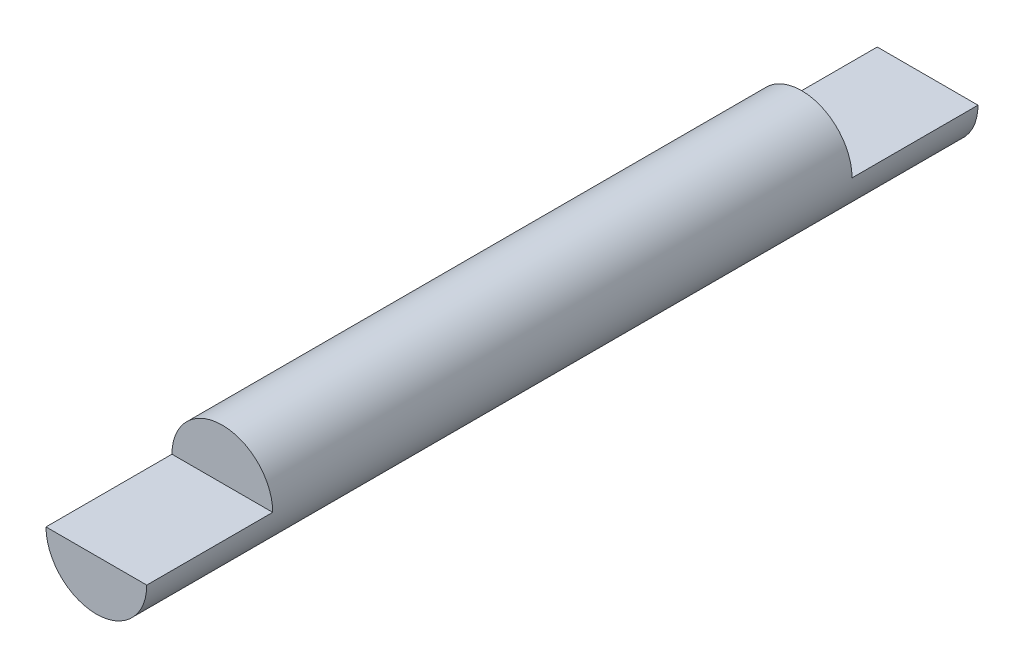
ISO-10303-21;
HEADER;
FILE_DESCRIPTION(('STEP AP214'),'2;1');
FILE_NAME('part.step','',(''),(''),'','','');
FILE_SCHEMA(('AUTOMOTIVE_DESIGN { 1 0 10303 214 1 1 1 1 }'));
ENDSEC;
DATA;
#1=APPLICATION_CONTEXT('core data for automotive mechanical design processes');
#2=APPLICATION_PROTOCOL_DEFINITION('international standard','automotive_design',2000,#1);
#3=PRODUCT_CONTEXT('',#1,'mechanical');
#4=PRODUCT('Part','Part','',(#3));
#5=PRODUCT_RELATED_PRODUCT_CATEGORY('part','',(#4));
#6=PRODUCT_DEFINITION_FORMATION('','',#4);
#7=PRODUCT_DEFINITION_CONTEXT('part definition',#1,'design');
#8=PRODUCT_DEFINITION('design','',#6,#7);
#9=PRODUCT_DEFINITION_SHAPE('','',#8);
#10=(LENGTH_UNIT() NAMED_UNIT(*) SI_UNIT(.MILLI.,.METRE.));
#11=(NAMED_UNIT(*) PLANE_ANGLE_UNIT() SI_UNIT($,.RADIAN.));
#12=(NAMED_UNIT(*) SI_UNIT($,.STERADIAN.) SOLID_ANGLE_UNIT());
#13=UNCERTAINTY_MEASURE_WITH_UNIT(LENGTH_MEASURE(1.E-05),#10,'distance_accuracy_value','');
#14=(GEOMETRIC_REPRESENTATION_CONTEXT(3) GLOBAL_UNCERTAINTY_ASSIGNED_CONTEXT((#13)) GLOBAL_UNIT_ASSIGNED_CONTEXT((#10,
#11,#12)) REPRESENTATION_CONTEXT('',''));
#15=CARTESIAN_POINT('',(0.,0.,0.));
#16=DIRECTION('',(0.,0.,1.));
#17=DIRECTION('',(1.,0.,0.));
#18=AXIS2_PLACEMENT_3D('',#15,#16,#17);
#19=CARTESIAN_POINT('',(0.,0.,33.));
#20=DIRECTION('',(0.,0.,-1.));
#21=DIRECTION('',(-1.,0.,0.));
#22=AXIS2_PLACEMENT_3D('',#19,#20,#21);
#23=CYLINDRICAL_SURFACE('',#22,2.);
#24=CARTESIAN_POINT('',(0.,0.,5.));
#25=DIRECTION('',(0.,0.,1.));
#26=DIRECTION('',(1.,0.,0.));
#27=AXIS2_PLACEMENT_3D('',#24,#25,#26);
#28=CIRCLE('',#27,2.);
#29=CARTESIAN_POINT('',(2.,0.,5.));
#30=VERTEX_POINT('',#29);
#31=CARTESIAN_POINT('',(-2.,0.,5.));
#32=VERTEX_POINT('',#31);
#33=EDGE_CURVE('E39',#30,#32,#28,.T.);
#34=ORIENTED_EDGE('',*,*,#33,.T.);
#35=DIRECTION('',(0.,0.,-1.));
#36=VECTOR('',#35,1.);
#37=CARTESIAN_POINT('',(-2.,0.,5.));
#38=LINE('',#37,#36);
#39=CARTESIAN_POINT('',(-2.,0.,0.));
#40=VERTEX_POINT('',#39);
#41=EDGE_CURVE('E93',#32,#40,#38,.T.);
#42=ORIENTED_EDGE('',*,*,#41,.T.);
#43=CARTESIAN_POINT('',(0.,0.,0.));
#44=DIRECTION('',(0.,0.,1.));
#45=DIRECTION('',(1.,0.,0.));
#46=AXIS2_PLACEMENT_3D('',#43,#44,#45);
#47=CIRCLE('',#46,2.);
#48=CARTESIAN_POINT('',(2.,0.,0.));
#49=VERTEX_POINT('',#48);
#50=EDGE_CURVE('E96',#40,#49,#47,.T.);
#51=ORIENTED_EDGE('',*,*,#50,.T.);
#52=DIRECTION('',(0.,0.,-1.));
#53=VECTOR('',#52,1.);
#54=CARTESIAN_POINT('',(2.,0.,5.));
#55=LINE('',#54,#53);
#56=EDGE_CURVE('E54',#30,#49,#55,.T.);
#57=ORIENTED_EDGE('',*,*,#56,.F.);
#58=EDGE_LOOP('',(#34,#42,#51,#57));
#59=FACE_BOUND('',#58,.T.);
#60=DIRECTION('',(0.,0.,1.));
#61=VECTOR('',#60,1.);
#62=CARTESIAN_POINT('',(2.,0.,28.));
#63=LINE('',#62,#61);
#64=CARTESIAN_POINT('',(2.,0.,28.));
#65=VERTEX_POINT('',#64);
#66=CARTESIAN_POINT('',(2.,0.,33.));
#67=VERTEX_POINT('',#66);
#68=EDGE_CURVE('E78',#65,#67,#63,.T.);
#69=ORIENTED_EDGE('',*,*,#68,.T.);
#70=CARTESIAN_POINT('',(0.,0.,33.));
#71=DIRECTION('',(0.,0.,1.));
#72=DIRECTION('',(1.,0.,0.));
#73=AXIS2_PLACEMENT_3D('',#70,#71,#72);
#74=CIRCLE('',#73,2.);
#75=CARTESIAN_POINT('',(-2.,0.,33.));
#76=VERTEX_POINT('',#75);
#77=EDGE_CURVE('E83',#76,#67,#74,.T.);
#78=ORIENTED_EDGE('',*,*,#77,.F.);
#79=DIRECTION('',(0.,0.,1.));
#80=VECTOR('',#79,1.);
#81=CARTESIAN_POINT('',(-2.,0.,28.));
#82=LINE('',#81,#80);
#83=CARTESIAN_POINT('',(-2.,0.,28.));
#84=VERTEX_POINT('',#83);
#85=EDGE_CURVE('E46',#84,#76,#82,.T.);
#86=ORIENTED_EDGE('',*,*,#85,.F.);
#87=CARTESIAN_POINT('',(0.,0.,28.));
#88=DIRECTION('',(0.,0.,-1.));
#89=DIRECTION('',(-1.,0.,0.));
#90=AXIS2_PLACEMENT_3D('',#87,#88,#89);
#91=CIRCLE('',#90,2.);
#92=EDGE_CURVE('E11',#84,#65,#91,.T.);
#93=ORIENTED_EDGE('',*,*,#92,.T.);
#94=EDGE_LOOP('',(#69,#78,#86,#93));
#95=FACE_BOUND('',#94,.T.);
#96=ADVANCED_FACE('F32',(#59,#95),#23,.T.);
#97=CARTESIAN_POINT('',(0.,0.,33.));
#98=DIRECTION('',(0.,0.,1.));
#99=DIRECTION('',(1.,0.,0.));
#100=AXIS2_PLACEMENT_3D('',#97,#98,#99);
#101=PLANE('',#100);
#102=ORIENTED_EDGE('',*,*,#77,.T.);
#103=DIRECTION('',(-1.,0.,0.));
#104=VECTOR('',#103,1.);
#105=CARTESIAN_POINT('',(2.,0.,33.));
#106=LINE('',#105,#104);
#107=EDGE_CURVE('E79',#67,#76,#106,.T.);
#108=ORIENTED_EDGE('',*,*,#107,.T.);
#109=EDGE_LOOP('',(#102,#108));
#110=FACE_BOUND('',#109,.T.);
#111=ADVANCED_FACE('F109',(#110),#101,.T.);
#112=CARTESIAN_POINT('',(0.,0.,0.));
#113=DIRECTION('',(0.,0.,1.));
#114=DIRECTION('',(1.,0.,0.));
#115=AXIS2_PLACEMENT_3D('',#112,#113,#114);
#116=PLANE('',#115);
#117=ORIENTED_EDGE('',*,*,#50,.F.);
#118=DIRECTION('',(-1.,0.,0.));
#119=VECTOR('',#118,1.);
#120=CARTESIAN_POINT('',(2.,0.,0.));
#121=LINE('',#120,#119);
#122=EDGE_CURVE('E85',#49,#40,#121,.T.);
#123=ORIENTED_EDGE('',*,*,#122,.F.);
#124=EDGE_LOOP('',(#117,#123));
#125=FACE_BOUND('',#124,.T.);
#126=ADVANCED_FACE('F107',(#125),#116,.F.);
#127=CARTESIAN_POINT('',(0.,0.,5.));
#128=DIRECTION('',(0.,0.,1.));
#129=DIRECTION('',(1.,0.,0.));
#130=AXIS2_PLACEMENT_3D('',#127,#128,#129);
#131=PLANE('',#130);
#132=DIRECTION('',(-1.,0.,0.));
#133=VECTOR('',#132,1.);
#134=CARTESIAN_POINT('',(2.,0.,5.));
#135=LINE('',#134,#133);
#136=EDGE_CURVE('E89',#30,#32,#135,.T.);
#137=ORIENTED_EDGE('',*,*,#136,.T.);
#138=ORIENTED_EDGE('',*,*,#33,.F.);
#139=EDGE_LOOP('',(#137,#138));
#140=FACE_BOUND('',#139,.T.);
#141=ADVANCED_FACE('F104',(#140),#131,.F.);
#142=CARTESIAN_POINT('',(2.,0.,5.));
#143=DIRECTION('',(0.,-1.,0.));
#144=DIRECTION('',(0.,0.,-1.));
#145=AXIS2_PLACEMENT_3D('',#142,#143,#144);
#146=PLANE('',#145);
#147=ORIENTED_EDGE('',*,*,#122,.T.);
#148=ORIENTED_EDGE('',*,*,#41,.F.);
#149=ORIENTED_EDGE('',*,*,#136,.F.);
#150=ORIENTED_EDGE('',*,*,#56,.T.);
#151=EDGE_LOOP('',(#147,#148,#149,#150));
#152=FACE_BOUND('',#151,.T.);
#153=ADVANCED_FACE('F105',(#152),#146,.F.);
#154=CARTESIAN_POINT('',(0.,0.,28.));
#155=DIRECTION('',(0.,0.,-1.));
#156=DIRECTION('',(1.,0.,0.));
#157=AXIS2_PLACEMENT_3D('',#154,#155,#156);
#158=PLANE('',#157);
#159=DIRECTION('',(-1.,0.,0.));
#160=VECTOR('',#159,1.);
#161=CARTESIAN_POINT('',(2.,0.,28.));
#162=LINE('',#161,#160);
#163=EDGE_CURVE('E73',#65,#84,#162,.T.);
#164=ORIENTED_EDGE('',*,*,#163,.F.);
#165=ORIENTED_EDGE('',*,*,#92,.F.);
#166=EDGE_LOOP('',(#164,#165));
#167=FACE_BOUND('',#166,.T.);
#168=ADVANCED_FACE('F72',(#167),#158,.F.);
#169=CARTESIAN_POINT('',(2.,0.,28.));
#170=DIRECTION('',(0.,1.,0.));
#171=DIRECTION('',(0.,0.,1.));
#172=AXIS2_PLACEMENT_3D('',#169,#170,#171);
#173=PLANE('',#172);
#174=ORIENTED_EDGE('',*,*,#107,.F.);
#175=ORIENTED_EDGE('',*,*,#68,.F.);
#176=ORIENTED_EDGE('',*,*,#163,.T.);
#177=ORIENTED_EDGE('',*,*,#85,.T.);
#178=EDGE_LOOP('',(#174,#175,#176,#177));
#179=FACE_BOUND('',#178,.T.);
#180=ADVANCED_FACE('F77',(#179),#173,.T.);
#181=CLOSED_SHELL('',(#96,#111,#126,#141,#153,#168,#180));
#182=MANIFOLD_SOLID_BREP('B2',#181);
#183=ADVANCED_BREP_SHAPE_REPRESENTATION('',(#18,#182),#14);
#184=SHAPE_DEFINITION_REPRESENTATION(#9,#183);
ENDSEC;
END-ISO-10303-21;
